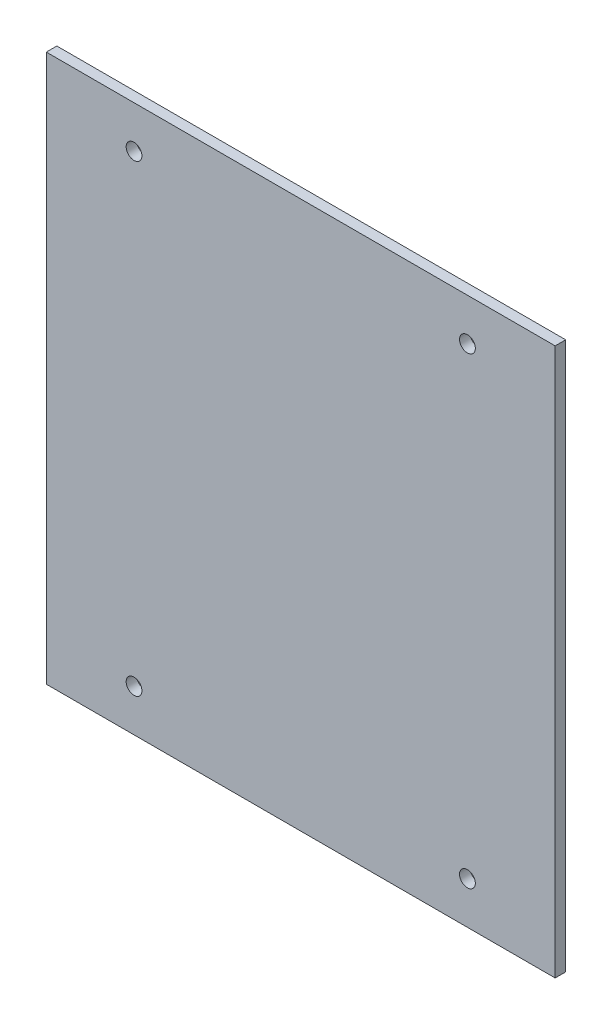
ISO-10303-21;
HEADER;
FILE_DESCRIPTION(('STEP AP214'),'2;1');
FILE_NAME('part.step','',(''),(''),'','','');
FILE_SCHEMA(('AUTOMOTIVE_DESIGN { 1 0 10303 214 1 1 1 1 }'));
ENDSEC;
DATA;
#1=APPLICATION_CONTEXT('core data for automotive mechanical design processes');
#2=APPLICATION_PROTOCOL_DEFINITION('international standard','automotive_design',2000,#1);
#3=PRODUCT_CONTEXT('',#1,'mechanical');
#4=PRODUCT('Part','Part','',(#3));
#5=PRODUCT_RELATED_PRODUCT_CATEGORY('part','',(#4));
#6=PRODUCT_DEFINITION_FORMATION('','',#4);
#7=PRODUCT_DEFINITION_CONTEXT('part definition',#1,'design');
#8=PRODUCT_DEFINITION('design','',#6,#7);
#9=PRODUCT_DEFINITION_SHAPE('','',#8);
#10=(LENGTH_UNIT() NAMED_UNIT(*) SI_UNIT(.MILLI.,.METRE.));
#11=(NAMED_UNIT(*) PLANE_ANGLE_UNIT() SI_UNIT($,.RADIAN.));
#12=(NAMED_UNIT(*) SI_UNIT($,.STERADIAN.) SOLID_ANGLE_UNIT());
#13=UNCERTAINTY_MEASURE_WITH_UNIT(LENGTH_MEASURE(1.E-05),#10,'distance_accuracy_value','');
#14=(GEOMETRIC_REPRESENTATION_CONTEXT(3) GLOBAL_UNCERTAINTY_ASSIGNED_CONTEXT((#13)) GLOBAL_UNIT_ASSIGNED_CONTEXT((#10,
#11,#12)) REPRESENTATION_CONTEXT('',''));
#15=CARTESIAN_POINT('',(0.,0.,0.));
#16=DIRECTION('',(0.,0.,1.));
#17=DIRECTION('',(1.,0.,0.));
#18=AXIS2_PLACEMENT_3D('',#15,#16,#17);
#19=CARTESIAN_POINT('',(0.,0.,0.));
#20=DIRECTION('',(0.,0.,1.));
#21=DIRECTION('',(1.,0.,0.));
#22=AXIS2_PLACEMENT_3D('',#19,#20,#21);
#23=PLANE('',#22);
#24=CARTESIAN_POINT('',(47.5,-66.,0.));
#25=DIRECTION('',(0.,0.,1.));
#26=DIRECTION('',(1.,0.,0.));
#27=AXIS2_PLACEMENT_3D('',#24,#25,#26);
#28=CIRCLE('',#27,2.25);
#29=CARTESIAN_POINT('',(49.75,-66.,0.));
#30=VERTEX_POINT('',#29);
#31=EDGE_CURVE('E128',#30,#30,#28,.F.);
#32=ORIENTED_EDGE('',*,*,#31,.F.);
#33=EDGE_LOOP('',(#32));
#34=FACE_BOUND('',#33,.T.);
#35=CARTESIAN_POINT('',(47.5,66.,0.));
#36=DIRECTION('',(0.,0.,1.));
#37=DIRECTION('',(1.,0.,0.));
#38=AXIS2_PLACEMENT_3D('',#35,#36,#37);
#39=CIRCLE('',#38,2.25);
#40=CARTESIAN_POINT('',(49.75,66.,0.));
#41=VERTEX_POINT('',#40);
#42=EDGE_CURVE('E122',#41,#41,#39,.F.);
#43=ORIENTED_EDGE('',*,*,#42,.F.);
#44=EDGE_LOOP('',(#43));
#45=FACE_BOUND('',#44,.T.);
#46=DIRECTION('',(0.,-1.,0.));
#47=VECTOR('',#46,1.);
#48=CARTESIAN_POINT('',(-72.5,-78.,0.));
#49=LINE('',#48,#47);
#50=CARTESIAN_POINT('',(-72.5,78.,0.));
#51=VERTEX_POINT('',#50);
#52=CARTESIAN_POINT('',(-72.5,-78.,0.));
#53=VERTEX_POINT('',#52);
#54=EDGE_CURVE('E105',#51,#53,#49,.T.);
#55=ORIENTED_EDGE('',*,*,#54,.F.);
#56=DIRECTION('',(-1.,0.,0.));
#57=VECTOR('',#56,1.);
#58=CARTESIAN_POINT('',(72.5,78.,0.));
#59=LINE('',#58,#57);
#60=CARTESIAN_POINT('',(72.5,78.,0.));
#61=VERTEX_POINT('',#60);
#62=EDGE_CURVE('E81',#61,#51,#59,.T.);
#63=ORIENTED_EDGE('',*,*,#62,.F.);
#64=DIRECTION('',(0.,1.,0.));
#65=VECTOR('',#64,1.);
#66=CARTESIAN_POINT('',(72.5,-78.,0.));
#67=LINE('',#66,#65);
#68=CARTESIAN_POINT('',(72.5,-78.,0.));
#69=VERTEX_POINT('',#68);
#70=EDGE_CURVE('E75',#69,#61,#67,.T.);
#71=ORIENTED_EDGE('',*,*,#70,.F.);
#72=DIRECTION('',(1.,0.,0.));
#73=VECTOR('',#72,1.);
#74=CARTESIAN_POINT('',(72.5,-78.,0.));
#75=LINE('',#74,#73);
#76=EDGE_CURVE('E97',#53,#69,#75,.T.);
#77=ORIENTED_EDGE('',*,*,#76,.F.);
#78=EDGE_LOOP('',(#55,#63,#71,#77));
#79=FACE_BOUND('',#78,.T.);
#80=CARTESIAN_POINT('',(-47.5,66.,0.));
#81=DIRECTION('',(0.,0.,1.));
#82=DIRECTION('',(1.,0.,0.));
#83=AXIS2_PLACEMENT_3D('',#80,#81,#82);
#84=CIRCLE('',#83,2.25);
#85=CARTESIAN_POINT('',(-45.25,66.,0.));
#86=VERTEX_POINT('',#85);
#87=EDGE_CURVE('E108',#86,#86,#84,.F.);
#88=ORIENTED_EDGE('',*,*,#87,.F.);
#89=EDGE_LOOP('',(#88));
#90=FACE_BOUND('',#89,.T.);
#91=CARTESIAN_POINT('',(-47.5,-66.,0.));
#92=DIRECTION('',(0.,0.,1.));
#93=DIRECTION('',(1.,0.,0.));
#94=AXIS2_PLACEMENT_3D('',#91,#92,#93);
#95=CIRCLE('',#94,2.25);
#96=CARTESIAN_POINT('',(-45.25,-66.,0.));
#97=VERTEX_POINT('',#96);
#98=EDGE_CURVE('E134',#97,#97,#95,.F.);
#99=ORIENTED_EDGE('',*,*,#98,.F.);
#100=EDGE_LOOP('',(#99));
#101=FACE_BOUND('',#100,.T.);
#102=ADVANCED_FACE('F41',(#34,#45,#79,#90,#101),#23,.F.);
#103=CARTESIAN_POINT('',(-72.5,-78.,3.));
#104=DIRECTION('',(1.,0.,0.));
#105=DIRECTION('',(0.,0.,-1.));
#106=AXIS2_PLACEMENT_3D('',#103,#104,#105);
#107=PLANE('',#106);
#108=ORIENTED_EDGE('',*,*,#54,.T.);
#109=DIRECTION('',(0.,0.,-1.));
#110=VECTOR('',#109,1.);
#111=CARTESIAN_POINT('',(-72.5,-78.,3.));
#112=LINE('',#111,#110);
#113=CARTESIAN_POINT('',(-72.5,-78.,3.));
#114=VERTEX_POINT('',#113);
#115=EDGE_CURVE('E11',#114,#53,#112,.T.);
#116=ORIENTED_EDGE('',*,*,#115,.F.);
#117=DIRECTION('',(0.,-1.,0.));
#118=VECTOR('',#117,1.);
#119=CARTESIAN_POINT('',(-72.5,-78.,3.));
#120=LINE('',#119,#118);
#121=CARTESIAN_POINT('',(-72.5,78.,3.));
#122=VERTEX_POINT('',#121);
#123=EDGE_CURVE('E93',#122,#114,#120,.T.);
#124=ORIENTED_EDGE('',*,*,#123,.F.);
#125=DIRECTION('',(0.,0.,-1.));
#126=VECTOR('',#125,1.);
#127=CARTESIAN_POINT('',(-72.5,78.,3.));
#128=LINE('',#127,#126);
#129=EDGE_CURVE('E101',#122,#51,#128,.T.);
#130=ORIENTED_EDGE('',*,*,#129,.T.);
#131=EDGE_LOOP('',(#108,#116,#124,#130));
#132=FACE_BOUND('',#131,.T.);
#133=ADVANCED_FACE('F43',(#132),#107,.F.);
#134=CARTESIAN_POINT('',(72.5,-78.,3.));
#135=DIRECTION('',(0.,1.,0.));
#136=DIRECTION('',(-1.,0.,0.));
#137=AXIS2_PLACEMENT_3D('',#134,#135,#136);
#138=PLANE('',#137);
#139=ORIENTED_EDGE('',*,*,#76,.T.);
#140=DIRECTION('',(0.,0.,-1.));
#141=VECTOR('',#140,1.);
#142=CARTESIAN_POINT('',(72.5,-78.,3.));
#143=LINE('',#142,#141);
#144=CARTESIAN_POINT('',(72.5,-78.,3.));
#145=VERTEX_POINT('',#144);
#146=EDGE_CURVE('E50',#145,#69,#143,.T.);
#147=ORIENTED_EDGE('',*,*,#146,.F.);
#148=DIRECTION('',(1.,0.,0.));
#149=VECTOR('',#148,1.);
#150=CARTESIAN_POINT('',(72.5,-78.,3.));
#151=LINE('',#150,#149);
#152=EDGE_CURVE('E88',#114,#145,#151,.T.);
#153=ORIENTED_EDGE('',*,*,#152,.F.);
#154=ORIENTED_EDGE('',*,*,#115,.T.);
#155=EDGE_LOOP('',(#139,#147,#153,#154));
#156=FACE_BOUND('',#155,.T.);
#157=ADVANCED_FACE('F96',(#156),#138,.F.);
#158=CARTESIAN_POINT('',(72.5,-78.,3.));
#159=DIRECTION('',(-1.,0.,0.));
#160=DIRECTION('',(0.,0.,1.));
#161=AXIS2_PLACEMENT_3D('',#158,#159,#160);
#162=PLANE('',#161);
#163=ORIENTED_EDGE('',*,*,#70,.T.);
#164=DIRECTION('',(0.,0.,-1.));
#165=VECTOR('',#164,1.);
#166=CARTESIAN_POINT('',(72.5,78.,3.));
#167=LINE('',#166,#165);
#168=CARTESIAN_POINT('',(72.5,78.,3.));
#169=VERTEX_POINT('',#168);
#170=EDGE_CURVE('E98',#169,#61,#167,.T.);
#171=ORIENTED_EDGE('',*,*,#170,.F.);
#172=DIRECTION('',(0.,1.,0.));
#173=VECTOR('',#172,1.);
#174=CARTESIAN_POINT('',(72.5,-78.,3.));
#175=LINE('',#174,#173);
#176=EDGE_CURVE('E91',#145,#169,#175,.T.);
#177=ORIENTED_EDGE('',*,*,#176,.F.);
#178=ORIENTED_EDGE('',*,*,#146,.T.);
#179=EDGE_LOOP('',(#163,#171,#177,#178));
#180=FACE_BOUND('',#179,.T.);
#181=ADVANCED_FACE('F99',(#180),#162,.F.);
#182=CARTESIAN_POINT('',(72.5,78.,3.));
#183=DIRECTION('',(0.,-1.,0.));
#184=DIRECTION('',(1.,0.,0.));
#185=AXIS2_PLACEMENT_3D('',#182,#183,#184);
#186=PLANE('',#185);
#187=ORIENTED_EDGE('',*,*,#62,.T.);
#188=ORIENTED_EDGE('',*,*,#129,.F.);
#189=DIRECTION('',(-1.,0.,0.));
#190=VECTOR('',#189,1.);
#191=CARTESIAN_POINT('',(72.5,78.,3.));
#192=LINE('',#191,#190);
#193=EDGE_CURVE('E58',#169,#122,#192,.T.);
#194=ORIENTED_EDGE('',*,*,#193,.F.);
#195=ORIENTED_EDGE('',*,*,#170,.T.);
#196=EDGE_LOOP('',(#187,#188,#194,#195));
#197=FACE_BOUND('',#196,.T.);
#198=ADVANCED_FACE('F113',(#197),#186,.F.);
#199=CARTESIAN_POINT('',(0.,0.,3.));
#200=DIRECTION('',(0.,0.,1.));
#201=DIRECTION('',(1.,0.,0.));
#202=AXIS2_PLACEMENT_3D('',#199,#200,#201);
#203=PLANE('',#202);
#204=CARTESIAN_POINT('',(-47.5,-66.,3.));
#205=DIRECTION('',(0.,0.,1.));
#206=DIRECTION('',(1.,0.,0.));
#207=AXIS2_PLACEMENT_3D('',#204,#205,#206);
#208=CIRCLE('',#207,2.25);
#209=CARTESIAN_POINT('',(-45.25,-66.,3.));
#210=VERTEX_POINT('',#209);
#211=EDGE_CURVE('E137',#210,#210,#208,.T.);
#212=ORIENTED_EDGE('',*,*,#211,.F.);
#213=EDGE_LOOP('',(#212));
#214=FACE_BOUND('',#213,.T.);
#215=CARTESIAN_POINT('',(47.5,-66.,3.));
#216=DIRECTION('',(0.,0.,1.));
#217=DIRECTION('',(1.,0.,0.));
#218=AXIS2_PLACEMENT_3D('',#215,#216,#217);
#219=CIRCLE('',#218,2.25);
#220=CARTESIAN_POINT('',(49.75,-66.,3.));
#221=VERTEX_POINT('',#220);
#222=EDGE_CURVE('E131',#221,#221,#219,.T.);
#223=ORIENTED_EDGE('',*,*,#222,.F.);
#224=EDGE_LOOP('',(#223));
#225=FACE_BOUND('',#224,.T.);
#226=CARTESIAN_POINT('',(47.5,66.,3.));
#227=DIRECTION('',(0.,0.,1.));
#228=DIRECTION('',(1.,0.,0.));
#229=AXIS2_PLACEMENT_3D('',#226,#227,#228);
#230=CIRCLE('',#229,2.25);
#231=CARTESIAN_POINT('',(49.75,66.,3.));
#232=VERTEX_POINT('',#231);
#233=EDGE_CURVE('E125',#232,#232,#230,.T.);
#234=ORIENTED_EDGE('',*,*,#233,.F.);
#235=EDGE_LOOP('',(#234));
#236=FACE_BOUND('',#235,.T.);
#237=CARTESIAN_POINT('',(-47.5,66.,3.));
#238=DIRECTION('',(0.,0.,1.));
#239=DIRECTION('',(1.,0.,0.));
#240=AXIS2_PLACEMENT_3D('',#237,#238,#239);
#241=CIRCLE('',#240,2.25);
#242=CARTESIAN_POINT('',(-45.25,66.,3.));
#243=VERTEX_POINT('',#242);
#244=EDGE_CURVE('E119',#243,#243,#241,.T.);
#245=ORIENTED_EDGE('',*,*,#244,.F.);
#246=EDGE_LOOP('',(#245));
#247=FACE_BOUND('',#246,.T.);
#248=ORIENTED_EDGE('',*,*,#123,.T.);
#249=ORIENTED_EDGE('',*,*,#152,.T.);
#250=ORIENTED_EDGE('',*,*,#176,.T.);
#251=ORIENTED_EDGE('',*,*,#193,.T.);
#252=EDGE_LOOP('',(#248,#249,#250,#251));
#253=FACE_BOUND('',#252,.T.);
#254=ADVANCED_FACE('F89',(#214,#225,#236,#247,#253),#203,.T.);
#255=CARTESIAN_POINT('',(-47.5,66.,3.));
#256=DIRECTION('',(0.,0.,1.));
#257=DIRECTION('',(1.,0.,0.));
#258=AXIS2_PLACEMENT_3D('',#255,#256,#257);
#259=CYLINDRICAL_SURFACE('',#258,2.25);
#260=ORIENTED_EDGE('',*,*,#87,.T.);
#261=EDGE_LOOP('',(#260));
#262=FACE_BOUND('',#261,.T.);
#263=ORIENTED_EDGE('',*,*,#244,.T.);
#264=EDGE_LOOP('',(#263));
#265=FACE_BOUND('',#264,.T.);
#266=ADVANCED_FACE('F184',(#262,#265),#259,.F.);
#267=CARTESIAN_POINT('',(47.5,66.,3.));
#268=DIRECTION('',(0.,0.,1.));
#269=DIRECTION('',(1.,0.,0.));
#270=AXIS2_PLACEMENT_3D('',#267,#268,#269);
#271=CYLINDRICAL_SURFACE('',#270,2.25);
#272=ORIENTED_EDGE('',*,*,#42,.T.);
#273=EDGE_LOOP('',(#272));
#274=FACE_BOUND('',#273,.T.);
#275=ORIENTED_EDGE('',*,*,#233,.T.);
#276=EDGE_LOOP('',(#275));
#277=FACE_BOUND('',#276,.T.);
#278=ADVANCED_FACE('F198',(#274,#277),#271,.F.);
#279=CARTESIAN_POINT('',(47.5,-66.,3.));
#280=DIRECTION('',(0.,0.,1.));
#281=DIRECTION('',(1.,0.,0.));
#282=AXIS2_PLACEMENT_3D('',#279,#280,#281);
#283=CYLINDRICAL_SURFACE('',#282,2.25);
#284=ORIENTED_EDGE('',*,*,#31,.T.);
#285=EDGE_LOOP('',(#284));
#286=FACE_BOUND('',#285,.T.);
#287=ORIENTED_EDGE('',*,*,#222,.T.);
#288=EDGE_LOOP('',(#287));
#289=FACE_BOUND('',#288,.T.);
#290=ADVANCED_FACE('F207',(#286,#289),#283,.F.);
#291=CARTESIAN_POINT('',(-47.5,-66.,3.));
#292=DIRECTION('',(0.,0.,1.));
#293=DIRECTION('',(1.,0.,0.));
#294=AXIS2_PLACEMENT_3D('',#291,#292,#293);
#295=CYLINDRICAL_SURFACE('',#294,2.25);
#296=ORIENTED_EDGE('',*,*,#98,.T.);
#297=EDGE_LOOP('',(#296));
#298=FACE_BOUND('',#297,.T.);
#299=ORIENTED_EDGE('',*,*,#211,.T.);
#300=EDGE_LOOP('',(#299));
#301=FACE_BOUND('',#300,.T.);
#302=ADVANCED_FACE('F143',(#298,#301),#295,.F.);
#303=CLOSED_SHELL('',(#102,#133,#157,#181,#198,#254,#266,#278,#290,#302));
#304=MANIFOLD_SOLID_BREP('B2',#303);
#305=ADVANCED_BREP_SHAPE_REPRESENTATION('',(#18,#304),#14);
#306=SHAPE_DEFINITION_REPRESENTATION(#9,#305);
ENDSEC;
END-ISO-10303-21;
